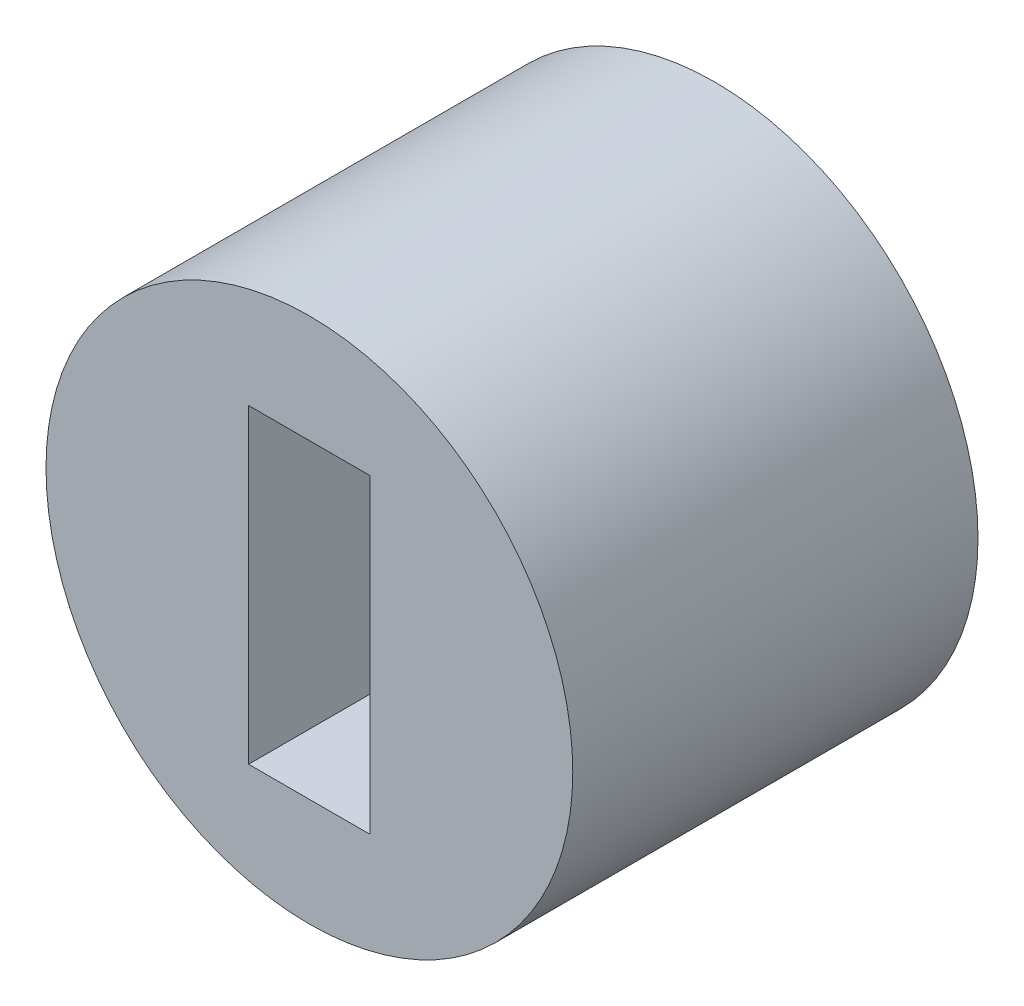
ISO-10303-21;
HEADER;
FILE_DESCRIPTION(('STEP AP214'),'2;1');
FILE_NAME('part.step','',(''),(''),'','','');
FILE_SCHEMA(('AUTOMOTIVE_DESIGN { 1 0 10303 214 1 1 1 1 }'));
ENDSEC;
DATA;
#1=APPLICATION_CONTEXT('core data for automotive mechanical design processes');
#2=APPLICATION_PROTOCOL_DEFINITION('international standard','automotive_design',2000,#1);
#3=PRODUCT_CONTEXT('',#1,'mechanical');
#4=PRODUCT('Part','Part','',(#3));
#5=PRODUCT_RELATED_PRODUCT_CATEGORY('part','',(#4));
#6=PRODUCT_DEFINITION_FORMATION('','',#4);
#7=PRODUCT_DEFINITION_CONTEXT('part definition',#1,'design');
#8=PRODUCT_DEFINITION('design','',#6,#7);
#9=PRODUCT_DEFINITION_SHAPE('','',#8);
#10=(LENGTH_UNIT() NAMED_UNIT(*) SI_UNIT(.MILLI.,.METRE.));
#11=(NAMED_UNIT(*) PLANE_ANGLE_UNIT() SI_UNIT($,.RADIAN.));
#12=(NAMED_UNIT(*) SI_UNIT($,.STERADIAN.) SOLID_ANGLE_UNIT());
#13=UNCERTAINTY_MEASURE_WITH_UNIT(LENGTH_MEASURE(1.E-05),#10,'distance_accuracy_value','');
#14=(GEOMETRIC_REPRESENTATION_CONTEXT(3) GLOBAL_UNCERTAINTY_ASSIGNED_CONTEXT((#13)) GLOBAL_UNIT_ASSIGNED_CONTEXT((#10,
#11,#12)) REPRESENTATION_CONTEXT('',''));
#15=CARTESIAN_POINT('',(0.,0.,0.));
#16=DIRECTION('',(0.,0.,1.));
#17=DIRECTION('',(1.,0.,0.));
#18=AXIS2_PLACEMENT_3D('',#15,#16,#17);
#19=CARTESIAN_POINT('',(0.,0.,-3.));
#20=DIRECTION('',(0.,0.,1.));
#21=DIRECTION('',(1.,0.,0.));
#22=AXIS2_PLACEMENT_3D('',#19,#20,#21);
#23=CYLINDRICAL_SURFACE('',#22,1.95);
#24=CARTESIAN_POINT('',(0.,0.,-3.));
#25=DIRECTION('',(0.,0.,1.));
#26=DIRECTION('',(1.,0.,0.));
#27=AXIS2_PLACEMENT_3D('',#24,#25,#26);
#28=CIRCLE('',#27,1.95);
#29=CARTESIAN_POINT('',(1.95,0.,-3.));
#30=VERTEX_POINT('',#29);
#31=EDGE_CURVE('E11',#30,#30,#28,.T.);
#32=ORIENTED_EDGE('',*,*,#31,.T.);
#33=EDGE_LOOP('',(#32));
#34=FACE_BOUND('',#33,.T.);
#35=CARTESIAN_POINT('',(0.,0.,0.));
#36=DIRECTION('',(0.,0.,1.));
#37=DIRECTION('',(1.,0.,0.));
#38=AXIS2_PLACEMENT_3D('',#35,#36,#37);
#39=CIRCLE('',#38,1.95);
#40=CARTESIAN_POINT('',(1.95,0.,0.));
#41=VERTEX_POINT('',#40);
#42=EDGE_CURVE('E38',#41,#41,#39,.T.);
#43=ORIENTED_EDGE('',*,*,#42,.F.);
#44=EDGE_LOOP('',(#43));
#45=FACE_BOUND('',#44,.T.);
#46=ADVANCED_FACE('F35',(#34,#45),#23,.T.);
#47=CARTESIAN_POINT('',(0.,0.,-3.));
#48=DIRECTION('',(0.,0.,1.));
#49=DIRECTION('',(1.,0.,0.));
#50=AXIS2_PLACEMENT_3D('',#47,#48,#49);
#51=PLANE('',#50);
#52=DIRECTION('',(0.,-1.,0.));
#53=VECTOR('',#52,1.);
#54=CARTESIAN_POINT('',(-0.45,-1.15,-3.));
#55=LINE('',#54,#53);
#56=CARTESIAN_POINT('',(-0.45,1.15,-3.));
#57=VERTEX_POINT('',#56);
#58=CARTESIAN_POINT('',(-0.45,-1.15,-3.));
#59=VERTEX_POINT('',#58);
#60=EDGE_CURVE('E83',#57,#59,#55,.T.);
#61=ORIENTED_EDGE('',*,*,#60,.T.);
#62=DIRECTION('',(1.,0.,0.));
#63=VECTOR('',#62,1.);
#64=CARTESIAN_POINT('',(0.45,-1.15,-3.));
#65=LINE('',#64,#63);
#66=CARTESIAN_POINT('',(0.45,-1.15,-3.));
#67=VERTEX_POINT('',#66);
#68=EDGE_CURVE('E77',#59,#67,#65,.T.);
#69=ORIENTED_EDGE('',*,*,#68,.T.);
#70=DIRECTION('',(0.,1.,0.));
#71=VECTOR('',#70,1.);
#72=CARTESIAN_POINT('',(0.45,1.15,-3.));
#73=LINE('',#72,#71);
#74=CARTESIAN_POINT('',(0.45,1.15,-3.));
#75=VERTEX_POINT('',#74);
#76=EDGE_CURVE('E86',#67,#75,#73,.T.);
#77=ORIENTED_EDGE('',*,*,#76,.T.);
#78=DIRECTION('',(-1.,0.,0.));
#79=VECTOR('',#78,1.);
#80=CARTESIAN_POINT('',(-0.45,1.15,-3.));
#81=LINE('',#80,#79);
#82=EDGE_CURVE('E49',#75,#57,#81,.T.);
#83=ORIENTED_EDGE('',*,*,#82,.T.);
#84=EDGE_LOOP('',(#61,#69,#77,#83));
#85=FACE_BOUND('',#84,.T.);
#86=ORIENTED_EDGE('',*,*,#31,.F.);
#87=EDGE_LOOP('',(#86));
#88=FACE_BOUND('',#87,.T.);
#89=ADVANCED_FACE('F90',(#85,#88),#51,.F.);
#90=CARTESIAN_POINT('',(0.,0.,0.));
#91=DIRECTION('',(0.,0.,1.));
#92=DIRECTION('',(1.,0.,0.));
#93=AXIS2_PLACEMENT_3D('',#90,#91,#92);
#94=PLANE('',#93);
#95=DIRECTION('',(1.,0.,0.));
#96=VECTOR('',#95,1.);
#97=CARTESIAN_POINT('',(0.45,-1.15,0.));
#98=LINE('',#97,#96);
#99=CARTESIAN_POINT('',(-0.45,-1.15,0.));
#100=VERTEX_POINT('',#99);
#101=CARTESIAN_POINT('',(0.45,-1.15,0.));
#102=VERTEX_POINT('',#101);
#103=EDGE_CURVE('E57',#100,#102,#98,.T.);
#104=ORIENTED_EDGE('',*,*,#103,.F.);
#105=DIRECTION('',(0.,-1.,0.));
#106=VECTOR('',#105,1.);
#107=CARTESIAN_POINT('',(-0.45,-1.15,0.));
#108=LINE('',#107,#106);
#109=CARTESIAN_POINT('',(-0.45,1.15,0.));
#110=VERTEX_POINT('',#109);
#111=EDGE_CURVE('E93',#110,#100,#108,.T.);
#112=ORIENTED_EDGE('',*,*,#111,.F.);
#113=DIRECTION('',(-1.,0.,0.));
#114=VECTOR('',#113,1.);
#115=CARTESIAN_POINT('',(-0.45,1.15,0.));
#116=LINE('',#115,#114);
#117=CARTESIAN_POINT('',(0.45,1.15,0.));
#118=VERTEX_POINT('',#117);
#119=EDGE_CURVE('E96',#118,#110,#116,.T.);
#120=ORIENTED_EDGE('',*,*,#119,.F.);
#121=DIRECTION('',(0.,1.,0.));
#122=VECTOR('',#121,1.);
#123=CARTESIAN_POINT('',(0.45,1.15,0.));
#124=LINE('',#123,#122);
#125=EDGE_CURVE('E102',#102,#118,#124,.T.);
#126=ORIENTED_EDGE('',*,*,#125,.F.);
#127=EDGE_LOOP('',(#104,#112,#120,#126));
#128=FACE_BOUND('',#127,.T.);
#129=ORIENTED_EDGE('',*,*,#42,.T.);
#130=EDGE_LOOP('',(#129));
#131=FACE_BOUND('',#130,.T.);
#132=ADVANCED_FACE('F114',(#128,#131),#94,.T.);
#133=CARTESIAN_POINT('',(0.45,-1.15,-3.));
#134=DIRECTION('',(0.,-1.,0.));
#135=DIRECTION('',(1.,0.,0.));
#136=AXIS2_PLACEMENT_3D('',#133,#134,#135);
#137=PLANE('',#136);
#138=ORIENTED_EDGE('',*,*,#103,.T.);
#139=DIRECTION('',(0.,0.,1.));
#140=VECTOR('',#139,1.);
#141=CARTESIAN_POINT('',(0.45,-1.15,-3.));
#142=LINE('',#141,#140);
#143=EDGE_CURVE('E73',#67,#102,#142,.T.);
#144=ORIENTED_EDGE('',*,*,#143,.F.);
#145=ORIENTED_EDGE('',*,*,#68,.F.);
#146=DIRECTION('',(0.,0.,1.));
#147=VECTOR('',#146,1.);
#148=CARTESIAN_POINT('',(-0.45,-1.15,-3.));
#149=LINE('',#148,#147);
#150=EDGE_CURVE('E106',#59,#100,#149,.T.);
#151=ORIENTED_EDGE('',*,*,#150,.T.);
#152=EDGE_LOOP('',(#138,#144,#145,#151));
#153=FACE_BOUND('',#152,.T.);
#154=ADVANCED_FACE('F75',(#153),#137,.F.);
#155=CARTESIAN_POINT('',(-0.45,-1.15,-3.));
#156=DIRECTION('',(-1.,0.,0.));
#157=DIRECTION('',(0.,0.,1.));
#158=AXIS2_PLACEMENT_3D('',#155,#156,#157);
#159=PLANE('',#158);
#160=ORIENTED_EDGE('',*,*,#111,.T.);
#161=ORIENTED_EDGE('',*,*,#150,.F.);
#162=ORIENTED_EDGE('',*,*,#60,.F.);
#163=DIRECTION('',(0.,0.,1.));
#164=VECTOR('',#163,1.);
#165=CARTESIAN_POINT('',(-0.45,1.15,-3.));
#166=LINE('',#165,#164);
#167=EDGE_CURVE('E108',#57,#110,#166,.T.);
#168=ORIENTED_EDGE('',*,*,#167,.T.);
#169=EDGE_LOOP('',(#160,#161,#162,#168));
#170=FACE_BOUND('',#169,.T.);
#171=ADVANCED_FACE('F117',(#170),#159,.F.);
#172=CARTESIAN_POINT('',(-0.45,1.15,-3.));
#173=DIRECTION('',(0.,1.,0.));
#174=DIRECTION('',(0.,0.,1.));
#175=AXIS2_PLACEMENT_3D('',#172,#173,#174);
#176=PLANE('',#175);
#177=ORIENTED_EDGE('',*,*,#119,.T.);
#178=ORIENTED_EDGE('',*,*,#167,.F.);
#179=ORIENTED_EDGE('',*,*,#82,.F.);
#180=DIRECTION('',(0.,0.,1.));
#181=VECTOR('',#180,1.);
#182=CARTESIAN_POINT('',(0.45,1.15,-3.));
#183=LINE('',#182,#181);
#184=EDGE_CURVE('E82',#75,#118,#183,.T.);
#185=ORIENTED_EDGE('',*,*,#184,.T.);
#186=EDGE_LOOP('',(#177,#178,#179,#185));
#187=FACE_BOUND('',#186,.T.);
#188=ADVANCED_FACE('F110',(#187),#176,.F.);
#189=CARTESIAN_POINT('',(0.45,1.15,-3.));
#190=DIRECTION('',(1.,0.,0.));
#191=DIRECTION('',(0.,1.,0.));
#192=AXIS2_PLACEMENT_3D('',#189,#190,#191);
#193=PLANE('',#192);
#194=ORIENTED_EDGE('',*,*,#125,.T.);
#195=ORIENTED_EDGE('',*,*,#184,.F.);
#196=ORIENTED_EDGE('',*,*,#76,.F.);
#197=ORIENTED_EDGE('',*,*,#143,.T.);
#198=EDGE_LOOP('',(#194,#195,#196,#197));
#199=FACE_BOUND('',#198,.T.);
#200=ADVANCED_FACE('F87',(#199),#193,.F.);
#201=CLOSED_SHELL('',(#46,#89,#132,#154,#171,#188,#200));
#202=MANIFOLD_SOLID_BREP('B2',#201);
#203=ADVANCED_BREP_SHAPE_REPRESENTATION('',(#18,#202),#14);
#204=SHAPE_DEFINITION_REPRESENTATION(#9,#203);
ENDSEC;
END-ISO-10303-21;
